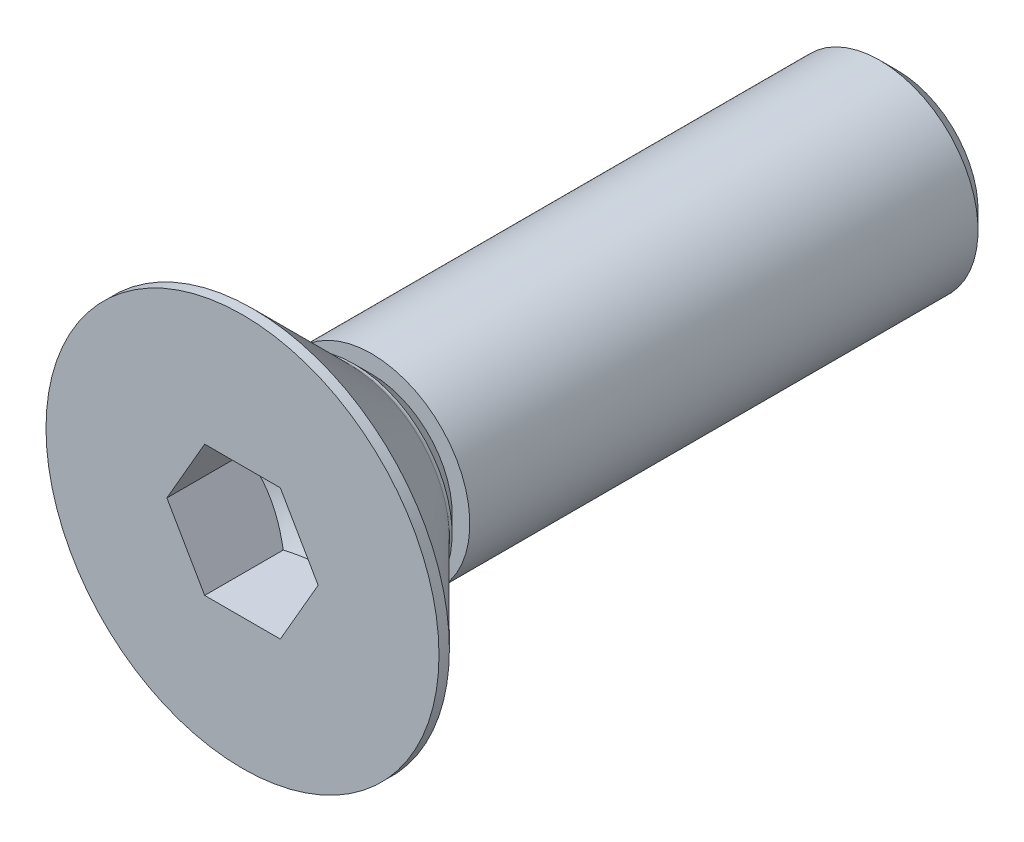
ISO-10303-21;
HEADER;
FILE_DESCRIPTION(('STEP AP214'),'2;1');
FILE_NAME('part.step','',(''),(''),'','','');
FILE_SCHEMA(('AUTOMOTIVE_DESIGN { 1 0 10303 214 1 1 1 1 }'));
ENDSEC;
DATA;
#1=APPLICATION_CONTEXT('core data for automotive mechanical design processes');
#2=APPLICATION_PROTOCOL_DEFINITION('international standard','automotive_design',2000,#1);
#3=PRODUCT_CONTEXT('',#1,'mechanical');
#4=PRODUCT('Part','Part','',(#3));
#5=PRODUCT_RELATED_PRODUCT_CATEGORY('part','',(#4));
#6=PRODUCT_DEFINITION_FORMATION('','',#4);
#7=PRODUCT_DEFINITION_CONTEXT('part definition',#1,'design');
#8=PRODUCT_DEFINITION('design','',#6,#7);
#9=PRODUCT_DEFINITION_SHAPE('','',#8);
#10=(LENGTH_UNIT() NAMED_UNIT(*) SI_UNIT(.MILLI.,.METRE.));
#11=(NAMED_UNIT(*) PLANE_ANGLE_UNIT() SI_UNIT($,.RADIAN.));
#12=(NAMED_UNIT(*) SI_UNIT($,.STERADIAN.) SOLID_ANGLE_UNIT());
#13=UNCERTAINTY_MEASURE_WITH_UNIT(LENGTH_MEASURE(1.E-05),#10,'distance_accuracy_value','');
#14=(GEOMETRIC_REPRESENTATION_CONTEXT(3) GLOBAL_UNCERTAINTY_ASSIGNED_CONTEXT((#13)) GLOBAL_UNIT_ASSIGNED_CONTEXT((#10,
#11,#12)) REPRESENTATION_CONTEXT('',''));
#15=CARTESIAN_POINT('',(0.,0.,0.));
#16=DIRECTION('',(0.,0.,1.));
#17=DIRECTION('',(1.,0.,0.));
#18=AXIS2_PLACEMENT_3D('',#15,#16,#17);
#19=CARTESIAN_POINT('',(0.,0.6146875,-10.));
#20=DIRECTION('',(0.,0.,-1.));
#21=DIRECTION('',(0.,1.,0.));
#22=AXIS2_PLACEMENT_3D('',#19,#20,#21);
#23=PLANE('',#22);
#24=CARTESIAN_POINT('',(0.,0.,-10.));
#25=DIRECTION('',(0.,0.,-1.));
#26=DIRECTION('',(0.,1.,0.));
#27=AXIS2_PLACEMENT_3D('',#24,#25,#26);
#28=CIRCLE('',#27,1.229375);
#29=CARTESIAN_POINT('',(0.,1.229375,-10.));
#30=VERTEX_POINT('',#29);
#31=EDGE_CURVE('E11',#30,#30,#28,.T.);
#32=ORIENTED_EDGE('',*,*,#31,.T.);
#33=EDGE_LOOP('',(#32));
#34=FACE_BOUND('',#33,.T.);
#35=ADVANCED_FACE('F16',(#34),#23,.T.);
#36=CARTESIAN_POINT('',(0.,0.,-9.8646875));
#37=DIRECTION('',(0.,0.,1.));
#38=DIRECTION('',(0.,1.,0.));
#39=AXIS2_PLACEMENT_3D('',#36,#37,#38);
#40=CONICAL_SURFACE('',#39,1.3646875,0.78539816339745);
#41=CARTESIAN_POINT('',(0.,0.,-9.729375));
#42=DIRECTION('',(0.,0.,-1.));
#43=DIRECTION('',(0.,1.,0.));
#44=AXIS2_PLACEMENT_3D('',#41,#42,#43);
#45=CIRCLE('',#44,1.5);
#46=CARTESIAN_POINT('',(0.,1.5,-9.729375));
#47=VERTEX_POINT('',#46);
#48=EDGE_CURVE('E26',#47,#47,#45,.T.);
#49=ORIENTED_EDGE('',*,*,#48,.T.);
#50=EDGE_LOOP('',(#49));
#51=FACE_BOUND('',#50,.T.);
#52=ORIENTED_EDGE('',*,*,#31,.F.);
#53=EDGE_LOOP('',(#52));
#54=FACE_BOUND('',#53,.T.);
#55=ADVANCED_FACE('F199',(#51,#54),#40,.T.);
#56=CARTESIAN_POINT('',(0.,0.,-5.7646875));
#57=DIRECTION('',(0.,0.,1.));
#58=DIRECTION('',(0.,1.,0.));
#59=AXIS2_PLACEMENT_3D('',#56,#57,#58);
#60=CYLINDRICAL_SURFACE('',#59,1.5);
#61=ORIENTED_EDGE('',*,*,#48,.F.);
#62=EDGE_LOOP('',(#61));
#63=FACE_BOUND('',#62,.T.);
#64=CARTESIAN_POINT('',(0.,0.,-1.970625));
#65=DIRECTION('',(0.,0.,-1.));
#66=DIRECTION('',(0.,1.,0.));
#67=AXIS2_PLACEMENT_3D('',#64,#65,#66);
#68=CIRCLE('',#67,1.5);
#69=CARTESIAN_POINT('',(0.,-1.5,-1.970625));
#70=VERTEX_POINT('',#69);
#71=EDGE_CURVE('E133',#70,#70,#68,.T.);
#72=ORIENTED_EDGE('',*,*,#71,.T.);
#73=EDGE_LOOP('',(#72));
#74=FACE_BOUND('',#73,.T.);
#75=ADVANCED_FACE('F190',(#63,#74),#60,.T.);
#76=CARTESIAN_POINT('',(0.,0.,-1.7));
#77=DIRECTION('',(0.,0.,-1.));
#78=DIRECTION('',(-1.,0.,0.));
#79=AXIS2_PLACEMENT_3D('',#76,#77,#78);
#80=TOROIDAL_SURFACE('',#79,1.6,0.1);
#81=CARTESIAN_POINT('',(0.,0.,-1.62928932188134));
#82=DIRECTION('',(0.,0.,-1.));
#83=DIRECTION('',(0.,1.,0.));
#84=AXIS2_PLACEMENT_3D('',#81,#82,#83);
#85=CIRCLE('',#84,1.52928932188135);
#86=CARTESIAN_POINT('',(0.,1.52928932188135,-1.62928932188134));
#87=VERTEX_POINT('',#86);
#88=EDGE_CURVE('E131',#87,#87,#85,.T.);
#89=ORIENTED_EDGE('',*,*,#88,.T.);
#90=EDGE_LOOP('',(#89));
#91=FACE_BOUND('',#90,.T.);
#92=CARTESIAN_POINT('',(0.,0.,-1.7));
#93=DIRECTION('',(0.,0.,-1.));
#94=DIRECTION('',(0.,1.,0.));
#95=AXIS2_PLACEMENT_3D('',#92,#93,#94);
#96=CIRCLE('',#95,1.5);
#97=CARTESIAN_POINT('',(0.,1.5,-1.7));
#98=VERTEX_POINT('',#97);
#99=EDGE_CURVE('E108',#98,#98,#96,.T.);
#100=ORIENTED_EDGE('',*,*,#99,.F.);
#101=EDGE_LOOP('',(#100));
#102=FACE_BOUND('',#101,.T.);
#103=ADVANCED_FACE('F187',(#91,#102),#80,.F.);
#104=CARTESIAN_POINT('',(0.,0.,-0.893933982822018));
#105=DIRECTION('',(0.,0.,1.));
#106=DIRECTION('',(0.,1.,0.));
#107=AXIS2_PLACEMENT_3D('',#104,#105,#106);
#108=CONICAL_SURFACE('',#107,2.26464466094068,0.785398163397448);
#109=CARTESIAN_POINT('',(0.,0.,-0.158578643762691));
#110=DIRECTION('',(0.,0.,-1.));
#111=DIRECTION('',(0.,1.,0.));
#112=AXIS2_PLACEMENT_3D('',#109,#110,#111);
#113=CIRCLE('',#112,3.);
#114=CARTESIAN_POINT('',(0.,3.,-0.15857864376269));
#115=VERTEX_POINT('',#114);
#116=EDGE_CURVE('E152',#115,#115,#113,.T.);
#117=ORIENTED_EDGE('',*,*,#116,.T.);
#118=EDGE_LOOP('',(#117));
#119=FACE_BOUND('',#118,.T.);
#120=ORIENTED_EDGE('',*,*,#88,.F.);
#121=EDGE_LOOP('',(#120));
#122=FACE_BOUND('',#121,.T.);
#123=ADVANCED_FACE('F189',(#119,#122),#108,.T.);
#124=CARTESIAN_POINT('',(0.,0.,-0.0792893218813458));
#125=DIRECTION('',(0.,0.,1.));
#126=DIRECTION('',(0.,1.,0.));
#127=AXIS2_PLACEMENT_3D('',#124,#125,#126);
#128=CYLINDRICAL_SURFACE('',#127,3.);
#129=CARTESIAN_POINT('',(0.,0.,0.));
#130=DIRECTION('',(0.,0.,-1.));
#131=DIRECTION('',(0.,1.,0.));
#132=AXIS2_PLACEMENT_3D('',#129,#130,#131);
#133=CIRCLE('',#132,3.);
#134=CARTESIAN_POINT('',(0.,3.,0.));
#135=VERTEX_POINT('',#134);
#136=EDGE_CURVE('E136',#135,#135,#133,.T.);
#137=ORIENTED_EDGE('',*,*,#136,.T.);
#138=EDGE_LOOP('',(#137));
#139=FACE_BOUND('',#138,.T.);
#140=ORIENTED_EDGE('',*,*,#116,.F.);
#141=EDGE_LOOP('',(#140));
#142=FACE_BOUND('',#141,.T.);
#143=ADVANCED_FACE('F197',(#139,#142),#128,.T.);
#144=CARTESIAN_POINT('',(0.,1.5,0.));
#145=DIRECTION('',(0.,0.,1.));
#146=DIRECTION('',(0.,-1.,0.));
#147=AXIS2_PLACEMENT_3D('',#144,#145,#146);
#148=PLANE('',#147);
#149=ORIENTED_EDGE('',*,*,#136,.F.);
#150=EDGE_LOOP('',(#149));
#151=FACE_BOUND('',#150,.T.);
#152=DIRECTION('',(-0.5,0.866025403784439,0.));
#153=VECTOR('',#152,1.);
#154=CARTESIAN_POINT('',(-1.19078452641916,0.062500233125054,0.));
#155=LINE('',#154,#153);
#156=CARTESIAN_POINT('',(-0.57735,-0.999999533749891,0.));
#157=VERTEX_POINT('',#156);
#158=CARTESIAN_POINT('',(-1.1547,0.,0.));
#159=VERTEX_POINT('',#158);
#160=EDGE_CURVE('E124',#157,#159,#155,.T.);
#161=ORIENTED_EDGE('',*,*,#160,.T.);
#162=DIRECTION('',(0.5,0.866025403784439,0.));
#163=VECTOR('',#162,1.);
#164=CARTESIAN_POINT('',(-0.541265473580836,1.06249976687495,0.));
#165=LINE('',#164,#163);
#166=CARTESIAN_POINT('',(-0.57735,0.999999533749891,0.));
#167=VERTEX_POINT('',#166);
#168=EDGE_CURVE('E134',#159,#167,#165,.T.);
#169=ORIENTED_EDGE('',*,*,#168,.T.);
#170=DIRECTION('',(1.,0.,0.));
#171=VECTOR('',#170,1.);
#172=CARTESIAN_POINT('',(0.,0.999999533749891,0.));
#173=LINE('',#172,#171);
#174=CARTESIAN_POINT('',(0.57735,0.999999533749891,0.));
#175=VERTEX_POINT('',#174);
#176=EDGE_CURVE('E105',#167,#175,#173,.T.);
#177=ORIENTED_EDGE('',*,*,#176,.T.);
#178=DIRECTION('',(0.5,-0.866025403784439,0.));
#179=VECTOR('',#178,1.);
#180=CARTESIAN_POINT('',(0.541265473580836,1.06249976687495,0.));
#181=LINE('',#180,#179);
#182=CARTESIAN_POINT('',(1.1547,0.,0.));
#183=VERTEX_POINT('',#182);
#184=EDGE_CURVE('E98',#175,#183,#181,.T.);
#185=ORIENTED_EDGE('',*,*,#184,.T.);
#186=DIRECTION('',(-0.5,-0.866025403784439,0.));
#187=VECTOR('',#186,1.);
#188=CARTESIAN_POINT('',(1.19078452641916,0.0625002331250542,0.));
#189=LINE('',#188,#187);
#190=CARTESIAN_POINT('',(0.57735,-0.999999533749891,0.));
#191=VERTEX_POINT('',#190);
#192=EDGE_CURVE('E81',#183,#191,#189,.T.);
#193=ORIENTED_EDGE('',*,*,#192,.T.);
#194=DIRECTION('',(-1.,0.,0.));
#195=VECTOR('',#194,1.);
#196=CARTESIAN_POINT('',(0.,-0.999999533749891,0.));
#197=LINE('',#196,#195);
#198=EDGE_CURVE('E20',#191,#157,#197,.T.);
#199=ORIENTED_EDGE('',*,*,#198,.T.);
#200=EDGE_LOOP('',(#161,#169,#177,#185,#193,#199));
#201=FACE_BOUND('',#200,.T.);
#202=ADVANCED_FACE('F103',(#151,#201),#148,.T.);
#203=CARTESIAN_POINT('',(-0.866025,0.499999766874945,1.));
#204=DIRECTION('',(-0.866025403784439,0.5,0.));
#205=DIRECTION('',(0.5,0.866025403784439,0.));
#206=AXIS2_PLACEMENT_3D('',#203,#204,#205);
#207=PLANE('',#206);
#208=ORIENTED_EDGE('',*,*,#168,.F.);
#209=DIRECTION('',(0.,0.,-1.));
#210=VECTOR('',#209,1.);
#211=CARTESIAN_POINT('',(-1.1547,0.,1.));
#212=LINE('',#211,#210);
#213=CARTESIAN_POINT('',(-1.1547,0.,-1.2));
#214=VERTEX_POINT('',#213);
#215=EDGE_CURVE('E150',#159,#214,#212,.T.);
#216=ORIENTED_EDGE('',*,*,#215,.T.);
#217=CARTESIAN_POINT('',(-1.1547,0.,-1.2));
#218=CARTESIAN_POINT('',(-0.866025000000001,0.499999766874945,-1.36666658895832));
#219=CARTESIAN_POINT('',(-0.57735,0.999999533749891,-1.2));
#220=(BOUNDED_CURVE() B_SPLINE_CURVE(2,(#217,#218,#219),.UNSPECIFIED.,.F.,
.F.) B_SPLINE_CURVE_WITH_KNOTS((3,3),(0.,1.16843559329444),
.UNSPECIFIED.) CURVE() GEOMETRIC_REPRESENTATION_ITEM() RATIONAL_B_SPLINE_CURVE((1.,
1.15470053837925,1.)) REPRESENTATION_ITEM(''));
#221=CARTESIAN_POINT('',(-0.57735,0.999999533749891,-1.2));
#222=VERTEX_POINT('',#221);
#223=EDGE_CURVE('E125',#214,#222,#220,.T.);
#224=ORIENTED_EDGE('',*,*,#223,.T.);
#225=DIRECTION('',(0.,0.,-1.));
#226=VECTOR('',#225,1.);
#227=CARTESIAN_POINT('',(-0.57735,0.999999533749891,1.));
#228=LINE('',#227,#226);
#229=EDGE_CURVE('E137',#167,#222,#228,.T.);
#230=ORIENTED_EDGE('',*,*,#229,.F.);
#231=EDGE_LOOP('',(#208,#216,#224,#230));
#232=FACE_BOUND('',#231,.T.);
#233=ADVANCED_FACE('F18',(#232),#207,.F.);
#234=CARTESIAN_POINT('',(0.,0.999999533749891,1.));
#235=DIRECTION('',(0.,1.,0.));
#236=DIRECTION('',(1.,0.,0.));
#237=AXIS2_PLACEMENT_3D('',#234,#235,#236);
#238=PLANE('',#237);
#239=ORIENTED_EDGE('',*,*,#176,.F.);
#240=ORIENTED_EDGE('',*,*,#229,.T.);
#241=CARTESIAN_POINT('',(-0.57735,0.999999533749891,-1.2));
#242=CARTESIAN_POINT('',(0.,0.999999533749893,-1.36666658895832));
#243=CARTESIAN_POINT('',(0.57735,0.999999533749891,-1.2));
#244=(BOUNDED_CURVE() B_SPLINE_CURVE(2,(#241,#242,#243),.UNSPECIFIED.,.F.,
.F.) B_SPLINE_CURVE_WITH_KNOTS((3,3),(0.,1.16843559329444),
.UNSPECIFIED.) CURVE() GEOMETRIC_REPRESENTATION_ITEM() RATIONAL_B_SPLINE_CURVE((1.,
1.15470053837925,1.)) REPRESENTATION_ITEM(''));
#245=CARTESIAN_POINT('',(0.57735,0.999999533749891,-1.2));
#246=VERTEX_POINT('',#245);
#247=EDGE_CURVE('E115',#222,#246,#244,.T.);
#248=ORIENTED_EDGE('',*,*,#247,.T.);
#249=DIRECTION('',(0.,0.,-1.));
#250=VECTOR('',#249,1.);
#251=CARTESIAN_POINT('',(0.57735,0.999999533749891,1.));
#252=LINE('',#251,#250);
#253=EDGE_CURVE('E107',#175,#246,#252,.T.);
#254=ORIENTED_EDGE('',*,*,#253,.F.);
#255=EDGE_LOOP('',(#239,#240,#248,#254));
#256=FACE_BOUND('',#255,.T.);
#257=ADVANCED_FACE('F221',(#256),#238,.F.);
#258=CARTESIAN_POINT('',(-0.866025,-0.499999766874946,1.));
#259=DIRECTION('',(-0.866025403784439,-0.5,0.));
#260=DIRECTION('',(-0.5,0.866025403784439,0.));
#261=AXIS2_PLACEMENT_3D('',#258,#259,#260);
#262=PLANE('',#261);
#263=ORIENTED_EDGE('',*,*,#160,.F.);
#264=DIRECTION('',(0.,0.,-1.));
#265=VECTOR('',#264,1.);
#266=CARTESIAN_POINT('',(-0.57735,-0.999999533749891,1.));
#267=LINE('',#266,#265);
#268=CARTESIAN_POINT('',(-0.57735,-0.999999533749892,-1.2));
#269=VERTEX_POINT('',#268);
#270=EDGE_CURVE('E142',#157,#269,#267,.T.);
#271=ORIENTED_EDGE('',*,*,#270,.T.);
#272=CARTESIAN_POINT('',(-0.57735,-0.999999533749891,-1.2));
#273=CARTESIAN_POINT('',(-0.866025,-0.499999766874945,-1.36666658895832));
#274=CARTESIAN_POINT('',(-1.1547,0.,-1.2));
#275=(BOUNDED_CURVE() B_SPLINE_CURVE(2,(#272,#273,#274),.UNSPECIFIED.,.F.,
.F.) B_SPLINE_CURVE_WITH_KNOTS((3,3),(0.,1.16843559329444),
.UNSPECIFIED.) CURVE() GEOMETRIC_REPRESENTATION_ITEM() RATIONAL_B_SPLINE_CURVE((1.,
1.15470053837925,1.)) REPRESENTATION_ITEM(''));
#276=EDGE_CURVE('E120',#269,#214,#275,.T.);
#277=ORIENTED_EDGE('',*,*,#276,.T.);
#278=ORIENTED_EDGE('',*,*,#215,.F.);
#279=EDGE_LOOP('',(#263,#271,#277,#278));
#280=FACE_BOUND('',#279,.T.);
#281=ADVANCED_FACE('F211',(#280),#262,.F.);
#282=CARTESIAN_POINT('',(0.,0.,-1.53333317791663));
#283=DIRECTION('',(0.,0.,1.));
#284=DIRECTION('',(0.,1.,0.));
#285=AXIS2_PLACEMENT_3D('',#282,#283,#284);
#286=CONICAL_SURFACE('',#285,0.57735,1.0471975511966);
#287=CARTESIAN_POINT('',(0.,0.,-1.86666635583326));
#288=VERTEX_POINT('',#287);
#289=VERTEX_LOOP('',#288);
#290=FACE_BOUND('',#289,.T.);
#291=CARTESIAN_POINT('',(0.57735,0.999999533749891,-1.2));
#292=CARTESIAN_POINT('',(0.866025000000001,0.499999766874945,-1.36666658895832));
#293=CARTESIAN_POINT('',(1.1547,0.,-1.2));
#294=(BOUNDED_CURVE() B_SPLINE_CURVE(2,(#291,#292,#293),.UNSPECIFIED.,.F.,
.F.) B_SPLINE_CURVE_WITH_KNOTS((3,3),(0.,1.16843559329444),
.UNSPECIFIED.) CURVE() GEOMETRIC_REPRESENTATION_ITEM() RATIONAL_B_SPLINE_CURVE((1.,
1.15470053837925,1.)) REPRESENTATION_ITEM(''));
#295=CARTESIAN_POINT('',(1.1547,0.,-1.2));
#296=VERTEX_POINT('',#295);
#297=EDGE_CURVE('E100',#246,#296,#294,.T.);
#298=ORIENTED_EDGE('',*,*,#297,.F.);
#299=ORIENTED_EDGE('',*,*,#247,.F.);
#300=ORIENTED_EDGE('',*,*,#223,.F.);
#301=ORIENTED_EDGE('',*,*,#276,.F.);
#302=CARTESIAN_POINT('',(0.57735,-0.999999533749891,-1.2));
#303=CARTESIAN_POINT('',(0.,-0.999999533749893,-1.36666658895832));
#304=CARTESIAN_POINT('',(-0.57735,-0.999999533749891,-1.2));
#305=(BOUNDED_CURVE() B_SPLINE_CURVE(2,(#302,#303,#304),.UNSPECIFIED.,.F.,
.F.) B_SPLINE_CURVE_WITH_KNOTS((3,3),(0.,1.16843559329444),
.UNSPECIFIED.) CURVE() GEOMETRIC_REPRESENTATION_ITEM() RATIONAL_B_SPLINE_CURVE((1.,
1.15470053837925,1.)) REPRESENTATION_ITEM(''));
#306=CARTESIAN_POINT('',(0.57735,-0.999999533749891,-1.2));
#307=VERTEX_POINT('',#306);
#308=EDGE_CURVE('E148',#307,#269,#305,.T.);
#309=ORIENTED_EDGE('',*,*,#308,.F.);
#310=CARTESIAN_POINT('',(1.1547,0.,-1.2));
#311=CARTESIAN_POINT('',(0.866025000000001,-0.499999766874945,-1.36666658895832));
#312=CARTESIAN_POINT('',(0.57735,-0.999999533749891,-1.2));
#313=(BOUNDED_CURVE() B_SPLINE_CURVE(2,(#310,#311,#312),.UNSPECIFIED.,.F.,
.F.) B_SPLINE_CURVE_WITH_KNOTS((3,3),(0.,1.16843559329444),
.UNSPECIFIED.) CURVE() GEOMETRIC_REPRESENTATION_ITEM() RATIONAL_B_SPLINE_CURVE((1.,
1.15470053837925,1.)) REPRESENTATION_ITEM(''));
#314=EDGE_CURVE('E92',#296,#307,#313,.T.);
#315=ORIENTED_EDGE('',*,*,#314,.F.);
#316=EDGE_LOOP('',(#298,#299,#300,#301,#309,#315));
#317=FACE_BOUND('',#316,.T.);
#318=ADVANCED_FACE('F239',(#290,#317),#286,.F.);
#319=CARTESIAN_POINT('',(0.,-0.999999533749891,1.));
#320=DIRECTION('',(0.,-1.,0.));
#321=DIRECTION('',(-1.,0.,0.));
#322=AXIS2_PLACEMENT_3D('',#319,#320,#321);
#323=PLANE('',#322);
#324=ORIENTED_EDGE('',*,*,#198,.F.);
#325=DIRECTION('',(0.,0.,-1.));
#326=VECTOR('',#325,1.);
#327=CARTESIAN_POINT('',(0.57735,-0.999999533749891,1.));
#328=LINE('',#327,#326);
#329=EDGE_CURVE('E88',#191,#307,#328,.T.);
#330=ORIENTED_EDGE('',*,*,#329,.T.);
#331=ORIENTED_EDGE('',*,*,#308,.T.);
#332=ORIENTED_EDGE('',*,*,#270,.F.);
#333=EDGE_LOOP('',(#324,#330,#331,#332));
#334=FACE_BOUND('',#333,.T.);
#335=ADVANCED_FACE('F179',(#334),#323,.F.);
#336=CARTESIAN_POINT('',(0.866025,-0.499999766874946,1.));
#337=DIRECTION('',(0.866025403784439,-0.5,0.));
#338=DIRECTION('',(-0.5,-0.866025403784439,0.));
#339=AXIS2_PLACEMENT_3D('',#336,#337,#338);
#340=PLANE('',#339);
#341=ORIENTED_EDGE('',*,*,#192,.F.);
#342=DIRECTION('',(0.,0.,-1.));
#343=VECTOR('',#342,1.);
#344=CARTESIAN_POINT('',(1.1547,0.,1.));
#345=LINE('',#344,#343);
#346=EDGE_CURVE('E85',#183,#296,#345,.T.);
#347=ORIENTED_EDGE('',*,*,#346,.T.);
#348=ORIENTED_EDGE('',*,*,#314,.T.);
#349=ORIENTED_EDGE('',*,*,#329,.F.);
#350=EDGE_LOOP('',(#341,#347,#348,#349));
#351=FACE_BOUND('',#350,.T.);
#352=ADVANCED_FACE('F83',(#351),#340,.F.);
#353=CARTESIAN_POINT('',(0.866025,0.499999766874946,1.));
#354=DIRECTION('',(0.866025403784439,0.5,0.));
#355=DIRECTION('',(0.5,-0.866025403784439,0.));
#356=AXIS2_PLACEMENT_3D('',#353,#354,#355);
#357=PLANE('',#356);
#358=ORIENTED_EDGE('',*,*,#184,.F.);
#359=ORIENTED_EDGE('',*,*,#253,.T.);
#360=ORIENTED_EDGE('',*,*,#297,.T.);
#361=ORIENTED_EDGE('',*,*,#346,.F.);
#362=EDGE_LOOP('',(#358,#359,#360,#361));
#363=FACE_BOUND('',#362,.T.);
#364=ADVANCED_FACE('F96',(#363),#357,.F.);
#365=CARTESIAN_POINT('',(0.,0.,-1.8353125));
#366=DIRECTION('',(0.,0.,1.));
#367=DIRECTION('',(0.,1.,0.));
#368=AXIS2_PLACEMENT_3D('',#365,#366,#367);
#369=CONICAL_SURFACE('',#368,1.3646875,0.785398163397448);
#370=CARTESIAN_POINT('',(0.,0.,-1.970625));
#371=DIRECTION('',(0.,0.,-1.));
#372=DIRECTION('',(0.,1.,0.));
#373=AXIS2_PLACEMENT_3D('',#370,#371,#372);
#374=CIRCLE('',#373,1.229375);
#375=CARTESIAN_POINT('',(0.,1.229375,-1.970625));
#376=VERTEX_POINT('',#375);
#377=EDGE_CURVE('E112',#376,#376,#374,.T.);
#378=ORIENTED_EDGE('',*,*,#377,.F.);
#379=EDGE_LOOP('',(#378));
#380=FACE_BOUND('',#379,.T.);
#381=ORIENTED_EDGE('',*,*,#99,.T.);
#382=EDGE_LOOP('',(#381));
#383=FACE_BOUND('',#382,.T.);
#384=ADVANCED_FACE('F185',(#380,#383),#369,.T.);
#385=CARTESIAN_POINT('',(0.,1.8646875,-1.970625));
#386=DIRECTION('',(0.,0.,-1.));
#387=DIRECTION('',(0.,1.,0.));
#388=AXIS2_PLACEMENT_3D('',#385,#386,#387);
#389=PLANE('',#388);
#390=ORIENTED_EDGE('',*,*,#377,.T.);
#391=EDGE_LOOP('',(#390));
#392=FACE_BOUND('',#391,.T.);
#393=ORIENTED_EDGE('',*,*,#71,.F.);
#394=EDGE_LOOP('',(#393));
#395=FACE_BOUND('',#394,.T.);
#396=ADVANCED_FACE('F229',(#392,#395),#389,.F.);
#397=CLOSED_SHELL('',(#35,#55,#75,#103,#123,#143,#202,#233,#257,#281,#318,#335,#352,#364,#384,#396));
#398=MANIFOLD_SOLID_BREP('B1',#397);
#399=ADVANCED_BREP_SHAPE_REPRESENTATION('',(#18,#398),#14);
#400=SHAPE_DEFINITION_REPRESENTATION(#9,#399);
ENDSEC;
END-ISO-10303-21;
